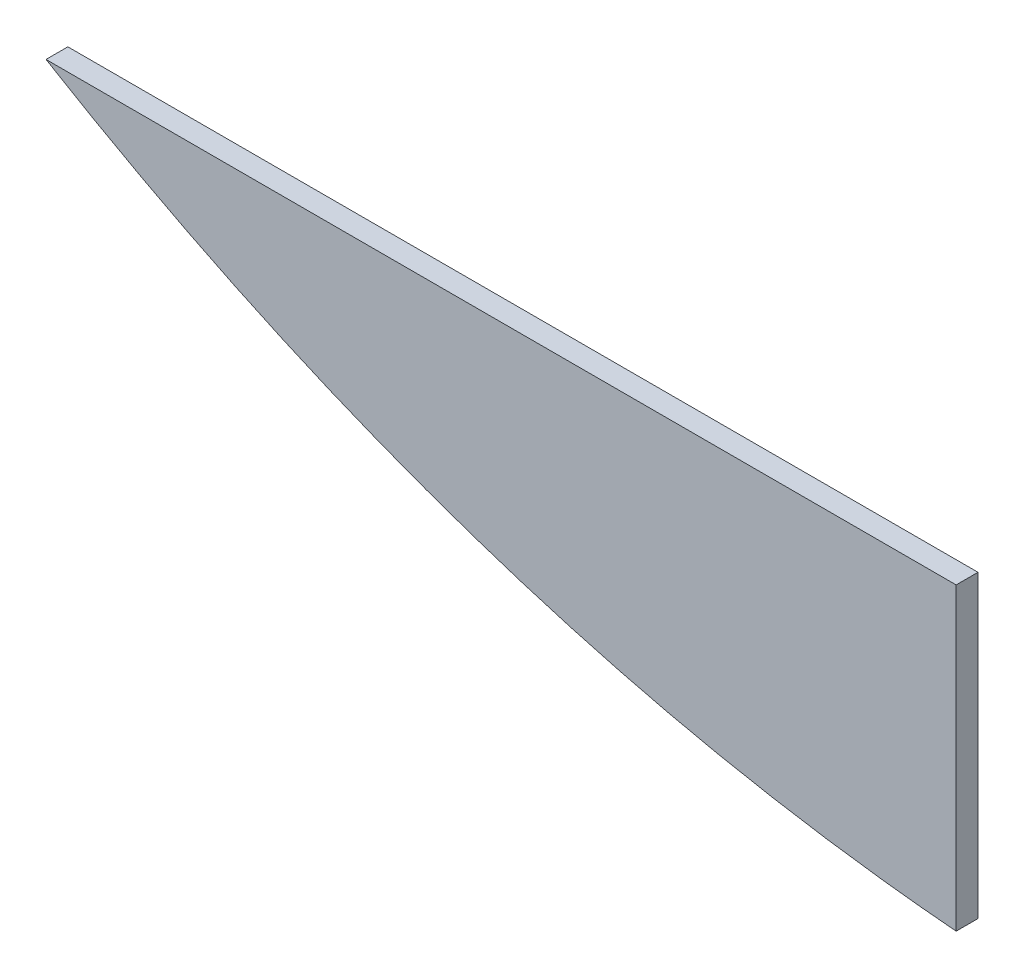
ISO-10303-21;
HEADER;
FILE_DESCRIPTION(('STEP AP214'),'2;1');
FILE_NAME('part.step','',(''),(''),'','','');
FILE_SCHEMA(('AUTOMOTIVE_DESIGN { 1 0 10303 214 1 1 1 1 }'));
ENDSEC;
DATA;
#1=APPLICATION_CONTEXT('core data for automotive mechanical design processes');
#2=APPLICATION_PROTOCOL_DEFINITION('international standard','automotive_design',2000,#1);
#3=PRODUCT_CONTEXT('',#1,'mechanical');
#4=PRODUCT('Part','Part','',(#3));
#5=PRODUCT_RELATED_PRODUCT_CATEGORY('part','',(#4));
#6=PRODUCT_DEFINITION_FORMATION('','',#4);
#7=PRODUCT_DEFINITION_CONTEXT('part definition',#1,'design');
#8=PRODUCT_DEFINITION('design','',#6,#7);
#9=PRODUCT_DEFINITION_SHAPE('','',#8);
#10=(LENGTH_UNIT() NAMED_UNIT(*) SI_UNIT(.MILLI.,.METRE.));
#11=(NAMED_UNIT(*) PLANE_ANGLE_UNIT() SI_UNIT($,.RADIAN.));
#12=(NAMED_UNIT(*) SI_UNIT($,.STERADIAN.) SOLID_ANGLE_UNIT());
#13=UNCERTAINTY_MEASURE_WITH_UNIT(LENGTH_MEASURE(1.E-05),#10,'distance_accuracy_value','');
#14=(GEOMETRIC_REPRESENTATION_CONTEXT(3) GLOBAL_UNCERTAINTY_ASSIGNED_CONTEXT((#13)) GLOBAL_UNIT_ASSIGNED_CONTEXT((#10,
#11,#12)) REPRESENTATION_CONTEXT('',''));
#15=CARTESIAN_POINT('',(0.,0.,0.));
#16=DIRECTION('',(0.,0.,1.));
#17=DIRECTION('',(1.,0.,0.));
#18=AXIS2_PLACEMENT_3D('',#15,#16,#17);
#19=CARTESIAN_POINT('',(-66.1131470418841,21.7851329900352,3.175));
#20=CARTESIAN_POINT('',(-24.2029100428776,-3.34023566504776,3.175));
#21=CARTESIAN_POINT('',(19.8725213183785,-17.8636576584045,3.175));
#22=CARTESIAN_POINT('',(66.1131470418841,-21.7851329900352,3.175));
#23=B_SPLINE_CURVE_WITH_KNOTS('',3,(#19,#20,#21,#22),.UNSPECIFIED.,.F.,.F.,(4,4),(0.,1.),.UNSPECIFIED.);
#24=DIRECTION('',(0.,0.,-1.));
#25=VECTOR('',#24,1.);
#26=SURFACE_OF_LINEAR_EXTRUSION('',#23,#25);
#27=CARTESIAN_POINT('',(-66.1131470418841,21.7851329900352,0.));
#28=CARTESIAN_POINT('',(-24.2029100428776,-3.34023566504776,0.));
#29=CARTESIAN_POINT('',(19.8725213183785,-17.8636576584045,0.));
#30=CARTESIAN_POINT('',(66.1131470418841,-21.7851329900352,0.));
#31=B_SPLINE_CURVE_WITH_KNOTS('',3,(#27,#28,#29,#30),.UNSPECIFIED.,.F.,.F.,(4,4),(0.,1.),.UNSPECIFIED.);
#32=CARTESIAN_POINT('',(-66.1131470418841,21.7851329900352,0.));
#33=VERTEX_POINT('',#32);
#34=CARTESIAN_POINT('',(66.1131470418841,-21.7851329900352,0.));
#35=VERTEX_POINT('',#34);
#36=EDGE_CURVE('E80',#33,#35,#31,.T.);
#37=ORIENTED_EDGE('',*,*,#36,.T.);
#38=DIRECTION('',(0.,0.,-1.));
#39=VECTOR('',#38,1.);
#40=CARTESIAN_POINT('',(66.1131470418841,-21.7851329900352,3.175));
#41=LINE('',#40,#39);
#42=CARTESIAN_POINT('',(66.1131470418841,-21.7851329900352,3.175));
#43=VERTEX_POINT('',#42);
#44=EDGE_CURVE('E11',#43,#35,#41,.T.);
#45=ORIENTED_EDGE('',*,*,#44,.F.);
#46=CARTESIAN_POINT('',(-66.1131470418841,21.7851329900352,3.175));
#47=VERTEX_POINT('',#46);
#48=EDGE_CURVE('E74',#47,#43,#23,.T.);
#49=ORIENTED_EDGE('',*,*,#48,.F.);
#50=DIRECTION('',(0.,0.,-1.));
#51=VECTOR('',#50,1.);
#52=CARTESIAN_POINT('',(-66.1131470418841,21.7851329900352,3.175));
#53=LINE('',#52,#51);
#54=EDGE_CURVE('E81',#47,#33,#53,.T.);
#55=ORIENTED_EDGE('',*,*,#54,.T.);
#56=EDGE_LOOP('',(#37,#45,#49,#55));
#57=FACE_BOUND('',#56,.T.);
#58=ADVANCED_FACE('F33',(#57),#26,.F.);
#59=CARTESIAN_POINT('',(66.1131470418841,-21.7851329900352,3.175));
#60=DIRECTION('',(-1.,0.,0.));
#61=DIRECTION('',(0.,0.,1.));
#62=AXIS2_PLACEMENT_3D('',#59,#60,#61);
#63=PLANE('',#62);
#64=DIRECTION('',(0.,1.,0.));
#65=VECTOR('',#64,1.);
#66=CARTESIAN_POINT('',(66.1131470418841,-21.7851329900352,0.));
#67=LINE('',#66,#65);
#68=CARTESIAN_POINT('',(66.1131470418841,21.785132990035,0.));
#69=VERTEX_POINT('',#68);
#70=EDGE_CURVE('E62',#35,#69,#67,.T.);
#71=ORIENTED_EDGE('',*,*,#70,.T.);
#72=DIRECTION('',(0.,0.,-1.));
#73=VECTOR('',#72,1.);
#74=CARTESIAN_POINT('',(66.1131470418841,21.785132990035,3.175));
#75=LINE('',#74,#73);
#76=CARTESIAN_POINT('',(66.1131470418841,21.785132990035,3.175));
#77=VERTEX_POINT('',#76);
#78=EDGE_CURVE('E42',#77,#69,#75,.T.);
#79=ORIENTED_EDGE('',*,*,#78,.F.);
#80=DIRECTION('',(0.,1.,0.));
#81=VECTOR('',#80,1.);
#82=CARTESIAN_POINT('',(66.1131470418841,-21.7851329900352,3.175));
#83=LINE('',#82,#81);
#84=EDGE_CURVE('E70',#43,#77,#83,.T.);
#85=ORIENTED_EDGE('',*,*,#84,.F.);
#86=ORIENTED_EDGE('',*,*,#44,.T.);
#87=EDGE_LOOP('',(#71,#79,#85,#86));
#88=FACE_BOUND('',#87,.T.);
#89=ADVANCED_FACE('F71',(#88),#63,.F.);
#90=CARTESIAN_POINT('',(-66.1131470418841,21.7851329900352,3.175));
#91=DIRECTION('',(0.,-1.,0.));
#92=DIRECTION('',(1.,0.,0.));
#93=AXIS2_PLACEMENT_3D('',#90,#91,#92);
#94=PLANE('',#93);
#95=DIRECTION('',(-1.,0.,0.));
#96=VECTOR('',#95,1.);
#97=CARTESIAN_POINT('',(-66.1131470418841,21.7851329900352,0.));
#98=LINE('',#97,#96);
#99=EDGE_CURVE('E67',#69,#33,#98,.T.);
#100=ORIENTED_EDGE('',*,*,#99,.T.);
#101=ORIENTED_EDGE('',*,*,#54,.F.);
#102=DIRECTION('',(-1.,0.,0.));
#103=VECTOR('',#102,1.);
#104=CARTESIAN_POINT('',(-66.1131470418841,21.7851329900352,3.175));
#105=LINE('',#104,#103);
#106=EDGE_CURVE('E50',#77,#47,#105,.T.);
#107=ORIENTED_EDGE('',*,*,#106,.F.);
#108=ORIENTED_EDGE('',*,*,#78,.T.);
#109=EDGE_LOOP('',(#100,#101,#107,#108));
#110=FACE_BOUND('',#109,.T.);
#111=ADVANCED_FACE('F93',(#110),#94,.F.);
#112=CARTESIAN_POINT('',(-1.62389577168714,-7.95145999629461,3.175));
#113=DIRECTION('',(0.,0.,-1.));
#114=DIRECTION('',(-1.,0.,0.));
#115=AXIS2_PLACEMENT_3D('',#112,#113,#114);
#116=PLANE('',#115);
#117=ORIENTED_EDGE('',*,*,#48,.T.);
#118=ORIENTED_EDGE('',*,*,#84,.T.);
#119=ORIENTED_EDGE('',*,*,#106,.T.);
#120=EDGE_LOOP('',(#117,#118,#119));
#121=FACE_BOUND('',#120,.T.);
#122=ADVANCED_FACE('F77',(#121),#116,.F.);
#123=CARTESIAN_POINT('',(-1.62389577168714,-7.95145999629461,0.));
#124=DIRECTION('',(0.,0.,-1.));
#125=DIRECTION('',(-1.,0.,0.));
#126=AXIS2_PLACEMENT_3D('',#123,#124,#125);
#127=PLANE('',#126);
#128=ORIENTED_EDGE('',*,*,#36,.F.);
#129=ORIENTED_EDGE('',*,*,#99,.F.);
#130=ORIENTED_EDGE('',*,*,#70,.F.);
#131=EDGE_LOOP('',(#128,#129,#130));
#132=FACE_BOUND('',#131,.T.);
#133=ADVANCED_FACE('F94',(#132),#127,.T.);
#134=CLOSED_SHELL('',(#58,#89,#111,#122,#133));
#135=MANIFOLD_SOLID_BREP('B2',#134);
#136=ADVANCED_BREP_SHAPE_REPRESENTATION('',(#18,#135),#14);
#137=SHAPE_DEFINITION_REPRESENTATION(#9,#136);
ENDSEC;
END-ISO-10303-21;
